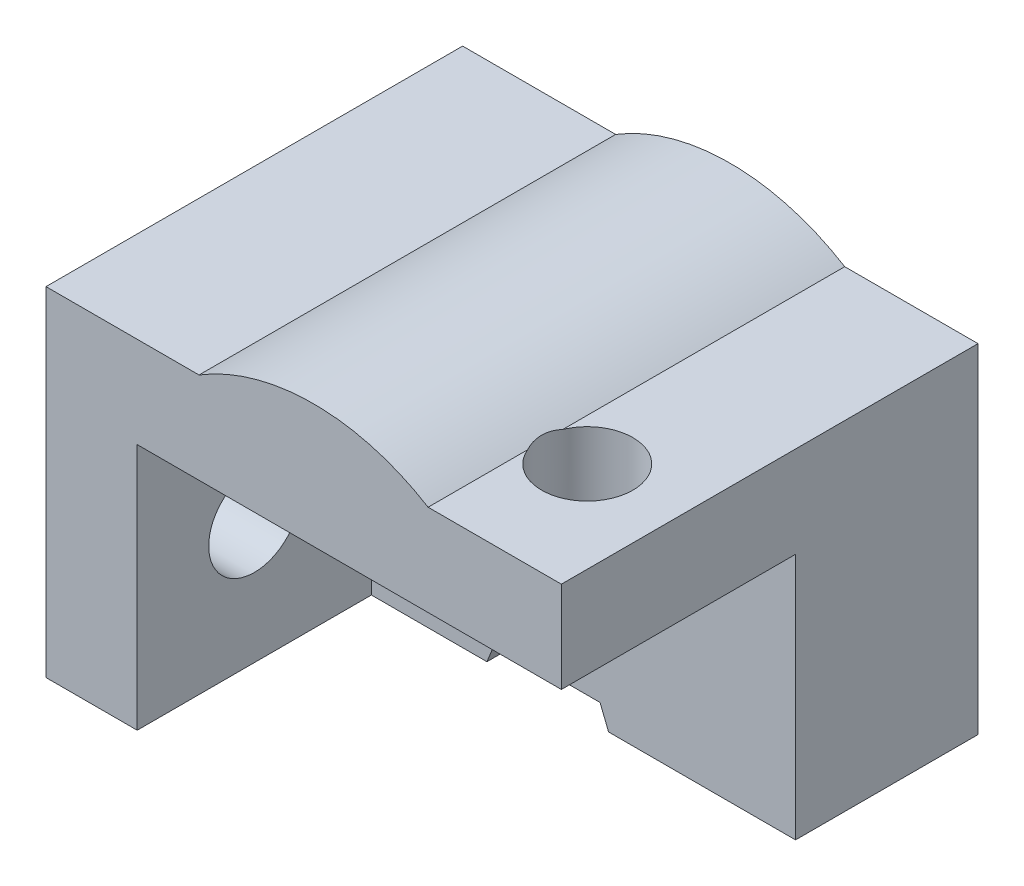
ISO-10303-21;
HEADER;
FILE_DESCRIPTION(('STEP AP214'),'2;1');
FILE_NAME('part.step','',(''),(''),'','','');
FILE_SCHEMA(('AUTOMOTIVE_DESIGN { 1 0 10303 214 1 1 1 1 }'));
ENDSEC;
DATA;
#1=APPLICATION_CONTEXT('core data for automotive mechanical design processes');
#2=APPLICATION_PROTOCOL_DEFINITION('international standard','automotive_design',2000,#1);
#3=PRODUCT_CONTEXT('',#1,'mechanical');
#4=PRODUCT('Part','Part','',(#3));
#5=PRODUCT_RELATED_PRODUCT_CATEGORY('part','',(#4));
#6=PRODUCT_DEFINITION_FORMATION('','',#4);
#7=PRODUCT_DEFINITION_CONTEXT('part definition',#1,'design');
#8=PRODUCT_DEFINITION('design','',#6,#7);
#9=PRODUCT_DEFINITION_SHAPE('','',#8);
#10=(LENGTH_UNIT() NAMED_UNIT(*) SI_UNIT(.MILLI.,.METRE.));
#11=(NAMED_UNIT(*) PLANE_ANGLE_UNIT() SI_UNIT($,.RADIAN.));
#12=(NAMED_UNIT(*) SI_UNIT($,.STERADIAN.) SOLID_ANGLE_UNIT());
#13=UNCERTAINTY_MEASURE_WITH_UNIT(LENGTH_MEASURE(1.E-05),#10,'distance_accuracy_value','');
#14=(GEOMETRIC_REPRESENTATION_CONTEXT(3) GLOBAL_UNCERTAINTY_ASSIGNED_CONTEXT((#13)) GLOBAL_UNIT_ASSIGNED_CONTEXT((#10,
#11,#12)) REPRESENTATION_CONTEXT('',''));
#15=CARTESIAN_POINT('',(0.,0.,0.));
#16=DIRECTION('',(0.,0.,1.));
#17=DIRECTION('',(1.,0.,0.));
#18=AXIS2_PLACEMENT_3D('',#15,#16,#17);
#19=CARTESIAN_POINT('',(-416.117492961021,132.337705363433,-6.));
#20=DIRECTION('',(-1.,0.,0.));
#21=DIRECTION('',(0.,0.,1.));
#22=AXIS2_PLACEMENT_3D('',#19,#20,#21);
#23=PLANE('',#22);
#24=CARTESIAN_POINT('',(-416.117492961021,136.405762971774,3.85111391374171));
#25=DIRECTION('',(-1.,0.,0.));
#26=DIRECTION('',(0.,0.,1.));
#27=AXIS2_PLACEMENT_3D('',#24,#25,#26);
#28=CIRCLE('',#27,1.5);
#29=CARTESIAN_POINT('',(-416.117492961021,136.405762971774,5.35111391374171));
#30=VERTEX_POINT('',#29);
#31=EDGE_CURVE('E301',#30,#30,#28,.T.);
#32=ORIENTED_EDGE('',*,*,#31,.F.);
#33=EDGE_LOOP('',(#32));
#34=FACE_BOUND('',#33,.T.);
#35=DIRECTION('',(0.,0.,1.));
#36=VECTOR('',#35,1.);
#37=CARTESIAN_POINT('',(-416.117492961021,132.337705363433,-6.));
#38=LINE('',#37,#36);
#39=CARTESIAN_POINT('',(-416.117492961021,132.337705363433,-6.));
#40=VERTEX_POINT('',#39);
#41=CARTESIAN_POINT('',(-416.117492961021,132.337705363433,7.7022278274818));
#42=VERTEX_POINT('',#41);
#43=EDGE_CURVE('E199',#40,#42,#38,.T.);
#44=ORIENTED_EDGE('',*,*,#43,.T.);
#45=DIRECTION('',(0.,-1.,0.));
#46=VECTOR('',#45,1.);
#47=CARTESIAN_POINT('',(-416.117492961021,143.473820580116,7.70222782748179));
#48=LINE('',#47,#46);
#49=CARTESIAN_POINT('',(-416.117492961021,143.473820580116,7.7022278274818));
#50=VERTEX_POINT('',#49);
#51=EDGE_CURVE('E309',#50,#42,#48,.T.);
#52=ORIENTED_EDGE('',*,*,#51,.F.);
#53=DIRECTION('',(0.,0.,1.));
#54=VECTOR('',#53,1.);
#55=CARTESIAN_POINT('',(-416.117492961021,143.473820580116,-6.));
#56=LINE('',#55,#54);
#57=CARTESIAN_POINT('',(-416.117492961021,143.473820580116,-6.));
#58=VERTEX_POINT('',#57);
#59=EDGE_CURVE('E175',#58,#50,#56,.T.);
#60=ORIENTED_EDGE('',*,*,#59,.F.);
#61=DIRECTION('',(0.,-1.,0.));
#62=VECTOR('',#61,1.);
#63=CARTESIAN_POINT('',(-416.117492961021,132.337705363433,-6.));
#64=LINE('',#63,#62);
#65=EDGE_CURVE('E218',#58,#40,#64,.T.);
#66=ORIENTED_EDGE('',*,*,#65,.T.);
#67=EDGE_LOOP('',(#44,#52,#60,#66));
#68=FACE_BOUND('',#67,.T.);
#69=ADVANCED_FACE('F37',(#34,#68),#23,.T.);
#70=CARTESIAN_POINT('',(-416.117492961021,143.473820580116,-6.));
#71=DIRECTION('',(0.,1.,0.));
#72=DIRECTION('',(0.,0.,1.));
#73=AXIS2_PLACEMENT_3D('',#70,#71,#72);
#74=PLANE('',#73);
#75=ORIENTED_EDGE('',*,*,#59,.T.);
#76=DIRECTION('',(-1.,0.,0.));
#77=VECTOR('',#76,1.);
#78=CARTESIAN_POINT('',(-411.084201079699,143.473820580116,7.70222782748179));
#79=LINE('',#78,#77);
#80=CARTESIAN_POINT('',(-411.084201079699,143.473820580116,7.70222782748179));
#81=VERTEX_POINT('',#80);
#82=EDGE_CURVE('E305',#81,#50,#79,.T.);
#83=ORIENTED_EDGE('',*,*,#82,.F.);
#84=DIRECTION('',(0.,0.,1.));
#85=VECTOR('',#84,1.);
#86=CARTESIAN_POINT('',(-411.084201079699,143.473820580116,-6.));
#87=LINE('',#86,#85);
#88=CARTESIAN_POINT('',(-411.084201079699,143.473820580116,-6.));
#89=VERTEX_POINT('',#88);
#90=EDGE_CURVE('E171',#89,#81,#87,.T.);
#91=ORIENTED_EDGE('',*,*,#90,.F.);
#92=DIRECTION('',(-1.,0.,0.));
#93=VECTOR('',#92,1.);
#94=CARTESIAN_POINT('',(-416.117492961021,143.473820580116,-6.));
#95=LINE('',#94,#93);
#96=EDGE_CURVE('E201',#89,#58,#95,.T.);
#97=ORIENTED_EDGE('',*,*,#96,.T.);
#98=EDGE_LOOP('',(#75,#83,#91,#97));
#99=FACE_BOUND('',#98,.T.);
#100=ADVANCED_FACE('F394',(#99),#74,.T.);
#101=CARTESIAN_POINT('',(-407.317492961529,137.337705363433,-6.));
#102=DIRECTION('',(0.,0.,1.));
#103=DIRECTION('',(1.,0.,0.));
#104=AXIS2_PLACEMENT_3D('',#101,#102,#103);
#105=CYLINDRICAL_SURFACE('',#104,7.19999999999263);
#106=CARTESIAN_POINT('',(-403.550784843358,143.473820580116,3.27102463656751));
#107=CARTESIAN_POINT('',(-403.564650401877,143.482331151145,3.3040855340003));
#108=CARTESIAN_POINT('',(-403.577390825231,143.490088377443,3.3377964479744));
#109=CARTESIAN_POINT('',(-403.600491203559,143.504072347545,3.40633862218128));
#110=CARTESIAN_POINT('',(-403.610850765418,143.510298838616,3.44117006634842));
#111=CARTESIAN_POINT('',(-403.638121552655,143.526621769063,3.54692348351834));
#112=CARTESIAN_POINT('',(-403.651279057615,143.534394488866,3.61923277436381));
#113=CARTESIAN_POINT('',(-403.66685834284,143.543585637171,3.76549338093935));
#114=CARTESIAN_POINT('',(-403.669260779367,143.544992616494,3.83944741505947));
#115=CARTESIAN_POINT('',(-403.663163543026,143.54140493934,3.98672819446422));
#116=CARTESIAN_POINT('',(-403.654670882556,143.536414400491,4.06005531268223));
#117=CARTESIAN_POINT('',(-403.631095503082,143.522412454836,4.18375522270031));
#118=CARTESIAN_POINT('',(-403.618526258255,143.51491961094,4.23480249352489));
#119=CARTESIAN_POINT('',(-403.588346191664,143.496743798843,4.33475904143771));
#120=CARTESIAN_POINT('',(-403.570738761059,143.486062976237,4.38366973120125));
#121=CARTESIAN_POINT('',(-403.550784843358,143.473820580116,4.43120319091591));
#122=B_SPLINE_CURVE_WITH_KNOTS('',3,(#106,#107,#108,#109,#110,#111,#112,#113,#114,#115,#116,
#117,#118,#119,#120,#121),.UNSPECIFIED.,.F.,.F.,(4,2,2,2,2,2,2,4),(0.,0.110480348319806,
0.220978925399781,0.441552332614348,0.662522297469281,0.883350111005528,1.04229878647173,
1.20114072557143),.UNSPECIFIED.);
#123=CARTESIAN_POINT('',(-403.550784843358,143.473820580116,3.27102463656751));
#124=VERTEX_POINT('',#123);
#125=CARTESIAN_POINT('',(-403.550784843358,143.473820580116,4.43120319091591));
#126=VERTEX_POINT('',#125);
#127=EDGE_CURVE('E51',#124,#126,#122,.T.);
#128=ORIENTED_EDGE('',*,*,#127,.F.);
#129=DIRECTION('',(0.,0.,1.));
#130=VECTOR('',#129,1.);
#131=CARTESIAN_POINT('',(-403.550784843358,143.473820580116,-6.));
#132=LINE('',#131,#130);
#133=CARTESIAN_POINT('',(-403.550784843358,143.473820580116,-6.));
#134=VERTEX_POINT('',#133);
#135=EDGE_CURVE('E159',#134,#124,#132,.T.);
#136=ORIENTED_EDGE('',*,*,#135,.F.);
#137=CARTESIAN_POINT('',(-407.317492961529,137.337705363433,-6.));
#138=DIRECTION('',(0.,0.,1.));
#139=DIRECTION('',(1.,0.,0.));
#140=AXIS2_PLACEMENT_3D('',#137,#138,#139);
#141=CIRCLE('',#140,7.19999999999263);
#142=EDGE_CURVE('E239',#134,#89,#141,.T.);
#143=ORIENTED_EDGE('',*,*,#142,.T.);
#144=ORIENTED_EDGE('',*,*,#90,.T.);
#145=CARTESIAN_POINT('',(-407.317492961529,137.337705363433,7.70222782748179));
#146=DIRECTION('',(0.,0.,1.));
#147=DIRECTION('',(1.,0.,0.));
#148=AXIS2_PLACEMENT_3D('',#145,#146,#147);
#149=CIRCLE('',#148,7.19999999999263);
#150=CARTESIAN_POINT('',(-403.550784843358,143.473820580116,7.7022278274818));
#151=VERTEX_POINT('',#150);
#152=EDGE_CURVE('E290',#151,#81,#149,.T.);
#153=ORIENTED_EDGE('',*,*,#152,.F.);
#154=EDGE_CURVE('E162',#126,#151,#132,.T.);
#155=ORIENTED_EDGE('',*,*,#154,.F.);
#156=EDGE_LOOP('',(#128,#136,#143,#144,#153,#155));
#157=FACE_BOUND('',#156,.T.);
#158=ADVANCED_FACE('F157',(#157),#105,.T.);
#159=CARTESIAN_POINT('',(-403.550784843358,143.473820580116,-6.));
#160=DIRECTION('',(0.,1.,0.));
#161=DIRECTION('',(-1.,0.,0.));
#162=AXIS2_PLACEMENT_3D('',#159,#160,#161);
#163=PLANE('',#162);
#164=CARTESIAN_POINT('',(-402.167492961451,143.473820580116,3.85111391374171));
#165=DIRECTION('',(0.,1.,0.));
#166=DIRECTION('',(-1.,0.,0.));
#167=AXIS2_PLACEMENT_3D('',#164,#165,#166);
#168=CIRCLE('',#167,1.50000000001471);
#169=EDGE_CURVE('E147',#126,#124,#168,.T.);
#170=ORIENTED_EDGE('',*,*,#169,.F.);
#171=ORIENTED_EDGE('',*,*,#154,.T.);
#172=DIRECTION('',(-1.,0.,0.));
#173=VECTOR('',#172,1.);
#174=CARTESIAN_POINT('',(-399.167492961451,143.473820580116,7.70222782748179));
#175=LINE('',#174,#173);
#176=CARTESIAN_POINT('',(-399.167492961451,143.473820580116,7.7022278274818));
#177=VERTEX_POINT('',#176);
#178=EDGE_CURVE('E287',#177,#151,#175,.T.);
#179=ORIENTED_EDGE('',*,*,#178,.F.);
#180=DIRECTION('',(0.,0.,1.));
#181=VECTOR('',#180,1.);
#182=CARTESIAN_POINT('',(-399.167492961451,143.473820580116,-6.));
#183=LINE('',#182,#181);
#184=CARTESIAN_POINT('',(-399.167492961451,143.473820580116,-6.));
#185=VERTEX_POINT('',#184);
#186=EDGE_CURVE('E178',#185,#177,#183,.T.);
#187=ORIENTED_EDGE('',*,*,#186,.F.);
#188=DIRECTION('',(-1.,0.,0.));
#189=VECTOR('',#188,1.);
#190=CARTESIAN_POINT('',(-403.550784843358,143.473820580116,-6.));
#191=LINE('',#190,#189);
#192=EDGE_CURVE('E169',#185,#134,#191,.T.);
#193=ORIENTED_EDGE('',*,*,#192,.T.);
#194=ORIENTED_EDGE('',*,*,#135,.T.);
#195=EDGE_LOOP('',(#170,#171,#179,#187,#193,#194));
#196=FACE_BOUND('',#195,.T.);
#197=ADVANCED_FACE('F167',(#196),#163,.T.);
#198=CARTESIAN_POINT('',(-399.167492961451,143.473820580116,-6.));
#199=DIRECTION('',(1.,0.,0.));
#200=DIRECTION('',(0.,0.,-1.));
#201=AXIS2_PLACEMENT_3D('',#198,#199,#200);
#202=PLANE('',#201);
#203=DIRECTION('',(0.,1.,0.));
#204=VECTOR('',#203,1.);
#205=CARTESIAN_POINT('',(-399.167492961451,143.473820580116,0.));
#206=LINE('',#205,#204);
#207=CARTESIAN_POINT('',(-399.167492961451,132.337705363433,0.));
#208=VERTEX_POINT('',#207);
#209=CARTESIAN_POINT('',(-399.167492961451,140.473820580115,0.));
#210=VERTEX_POINT('',#209);
#211=EDGE_CURVE('E59',#208,#210,#206,.T.);
#212=ORIENTED_EDGE('',*,*,#211,.F.);
#213=DIRECTION('',(0.,0.,1.));
#214=VECTOR('',#213,1.);
#215=CARTESIAN_POINT('',(-399.167492961451,132.337705363433,-6.));
#216=LINE('',#215,#214);
#217=CARTESIAN_POINT('',(-399.167492961451,132.337705363433,-6.));
#218=VERTEX_POINT('',#217);
#219=EDGE_CURVE('E183',#218,#208,#216,.T.);
#220=ORIENTED_EDGE('',*,*,#219,.F.);
#221=DIRECTION('',(0.,1.,0.));
#222=VECTOR('',#221,1.);
#223=CARTESIAN_POINT('',(-399.167492961451,143.473820580116,-6.));
#224=LINE('',#223,#222);
#225=EDGE_CURVE('E244',#218,#185,#224,.T.);
#226=ORIENTED_EDGE('',*,*,#225,.T.);
#227=ORIENTED_EDGE('',*,*,#186,.T.);
#228=DIRECTION('',(0.,1.,0.));
#229=VECTOR('',#228,1.);
#230=CARTESIAN_POINT('',(-399.167492961451,140.473820580115,7.70222782748179));
#231=LINE('',#230,#229);
#232=CARTESIAN_POINT('',(-399.167492961451,140.473820580115,7.7022278274818));
#233=VERTEX_POINT('',#232);
#234=EDGE_CURVE('E325',#233,#177,#231,.T.);
#235=ORIENTED_EDGE('',*,*,#234,.F.);
#236=DIRECTION('',(0.,0.,-1.));
#237=VECTOR('',#236,1.);
#238=CARTESIAN_POINT('',(-399.167492961451,140.473820580115,28.5862528223257));
#239=LINE('',#238,#237);
#240=EDGE_CURVE('E288',#233,#210,#239,.T.);
#241=ORIENTED_EDGE('',*,*,#240,.T.);
#242=EDGE_LOOP('',(#212,#220,#226,#227,#235,#241));
#243=FACE_BOUND('',#242,.T.);
#244=ADVANCED_FACE('F424',(#243),#202,.T.);
#245=CARTESIAN_POINT('',(-405.317492961514,132.337705363433,-6.));
#246=DIRECTION('',(0.,-1.,0.));
#247=DIRECTION('',(1.,0.,0.));
#248=AXIS2_PLACEMENT_3D('',#245,#246,#247);
#249=PLANE('',#248);
#250=DIRECTION('',(1.,0.,0.));
#251=VECTOR('',#250,1.);
#252=CARTESIAN_POINT('',(-405.317492961514,132.337705363433,0.));
#253=LINE('',#252,#251);
#254=CARTESIAN_POINT('',(-405.317492961514,132.337705363433,0.));
#255=VERTEX_POINT('',#254);
#256=EDGE_CURVE('E219',#255,#208,#253,.T.);
#257=ORIENTED_EDGE('',*,*,#256,.F.);
#258=DIRECTION('',(0.,0.,1.));
#259=VECTOR('',#258,1.);
#260=CARTESIAN_POINT('',(-405.317492961514,132.337705363433,-6.));
#261=LINE('',#260,#259);
#262=CARTESIAN_POINT('',(-405.317492961514,132.337705363433,-6.));
#263=VERTEX_POINT('',#262);
#264=EDGE_CURVE('E186',#263,#255,#261,.T.);
#265=ORIENTED_EDGE('',*,*,#264,.F.);
#266=DIRECTION('',(1.,0.,0.));
#267=VECTOR('',#266,1.);
#268=CARTESIAN_POINT('',(-405.317492961514,132.337705363433,-6.));
#269=LINE('',#268,#267);
#270=EDGE_CURVE('E248',#263,#218,#269,.T.);
#271=ORIENTED_EDGE('',*,*,#270,.T.);
#272=ORIENTED_EDGE('',*,*,#219,.T.);
#273=EDGE_LOOP('',(#257,#265,#271,#272));
#274=FACE_BOUND('',#273,.T.);
#275=ADVANCED_FACE('F431',(#274),#249,.T.);
#276=CARTESIAN_POINT('',(-405.597492961514,133.037705363433,-6.));
#277=DIRECTION('',(-0.928476690885259,-0.371390676354104,0.));
#278=DIRECTION('',(0.371390676354104,-0.928476690885259,0.));
#279=AXIS2_PLACEMENT_3D('',#276,#277,#278);
#280=PLANE('',#279);
#281=DIRECTION('',(0.,0.,-1.));
#282=VECTOR('',#281,1.);
#283=CARTESIAN_POINT('',(-405.42340051211,132.602474239922,-4.10000000001002));
#284=LINE('',#283,#282);
#285=CARTESIAN_POINT('',(-405.42340051211,132.602474239922,-6.));
#286=VERTEX_POINT('',#285);
#287=CARTESIAN_POINT('',(-405.42340051211,132.602474239922,-1.9));
#288=VERTEX_POINT('',#287);
#289=EDGE_CURVE('E269',#286,#288,#284,.F.);
#290=ORIENTED_EDGE('',*,*,#289,.F.);
#291=DIRECTION('',(0.371390676354104,-0.928476690885259,0.));
#292=VECTOR('',#291,1.);
#293=CARTESIAN_POINT('',(-405.597492961514,133.037705363433,-6.));
#294=LINE('',#293,#292);
#295=EDGE_CURVE('E252',#286,#263,#294,.T.);
#296=ORIENTED_EDGE('',*,*,#295,.T.);
#297=ORIENTED_EDGE('',*,*,#264,.T.);
#298=DIRECTION('',(0.371390676354104,-0.928476690885259,0.));
#299=VECTOR('',#298,1.);
#300=CARTESIAN_POINT('',(-405.597492961514,133.037705363433,0.));
#301=LINE('',#300,#299);
#302=CARTESIAN_POINT('',(-405.597492961514,133.037705363433,0.));
#303=VERTEX_POINT('',#302);
#304=EDGE_CURVE('E221',#303,#255,#301,.T.);
#305=ORIENTED_EDGE('',*,*,#304,.F.);
#306=DIRECTION('',(0.,0.,1.));
#307=VECTOR('',#306,1.);
#308=CARTESIAN_POINT('',(-405.597492961514,133.037705363433,-6.));
#309=LINE('',#308,#307);
#310=CARTESIAN_POINT('',(-405.597492961514,133.037705363433,-1.9));
#311=VERTEX_POINT('',#310);
#312=EDGE_CURVE('E189',#311,#303,#309,.T.);
#313=ORIENTED_EDGE('',*,*,#312,.F.);
#314=DIRECTION('',(-0.371390676354104,0.928476690885259,0.));
#315=VECTOR('',#314,1.);
#316=CARTESIAN_POINT('',(-405.597492961514,133.037705363433,-1.9));
#317=LINE('',#316,#315);
#318=EDGE_CURVE('E236',#288,#311,#317,.T.);
#319=ORIENTED_EDGE('',*,*,#318,.F.);
#320=EDGE_LOOP('',(#290,#296,#297,#305,#313,#319));
#321=FACE_BOUND('',#320,.T.);
#322=ADVANCED_FACE('F435',(#321),#280,.T.);
#323=CARTESIAN_POINT('',(-409.037492961514,133.037705363433,-6.));
#324=DIRECTION('',(0.,-1.,0.));
#325=DIRECTION('',(0.,0.,-1.));
#326=AXIS2_PLACEMENT_3D('',#323,#324,#325);
#327=PLANE('',#326);
#328=DIRECTION('',(-1.,0.,0.));
#329=VECTOR('',#328,1.);
#330=CARTESIAN_POINT('',(-409.037492961514,133.037705363433,-1.9));
#331=LINE('',#330,#329);
#332=CARTESIAN_POINT('',(-409.037492961514,133.037705363433,-1.9));
#333=VERTEX_POINT('',#332);
#334=EDGE_CURVE('E266',#311,#333,#331,.T.);
#335=ORIENTED_EDGE('',*,*,#334,.F.);
#336=ORIENTED_EDGE('',*,*,#312,.T.);
#337=DIRECTION('',(1.,0.,0.));
#338=VECTOR('',#337,1.);
#339=CARTESIAN_POINT('',(-409.037492961514,133.037705363433,0.));
#340=LINE('',#339,#338);
#341=CARTESIAN_POINT('',(-409.037492961514,133.037705363433,0.));
#342=VERTEX_POINT('',#341);
#343=EDGE_CURVE('E225',#342,#303,#340,.T.);
#344=ORIENTED_EDGE('',*,*,#343,.F.);
#345=DIRECTION('',(0.,0.,1.));
#346=VECTOR('',#345,1.);
#347=CARTESIAN_POINT('',(-409.037492961514,133.037705363433,-6.));
#348=LINE('',#347,#346);
#349=EDGE_CURVE('E192',#333,#342,#348,.T.);
#350=ORIENTED_EDGE('',*,*,#349,.F.);
#351=EDGE_LOOP('',(#335,#336,#344,#350));
#352=FACE_BOUND('',#351,.T.);
#353=ADVANCED_FACE('F442',(#352),#327,.T.);
#354=CARTESIAN_POINT('',(-409.317492961514,132.337705363433,-6.));
#355=DIRECTION('',(0.928476690885259,-0.371390676354104,0.));
#356=DIRECTION('',(0.371390676354104,0.928476690885259,0.));
#357=AXIS2_PLACEMENT_3D('',#354,#355,#356);
#358=PLANE('',#357);
#359=DIRECTION('',(0.,0.,-1.));
#360=VECTOR('',#359,1.);
#361=CARTESIAN_POINT('',(-409.211585410922,132.602474239914,-4.10000000001002));
#362=LINE('',#361,#360);
#363=CARTESIAN_POINT('',(-409.211585410922,132.602474239914,-1.9));
#364=VERTEX_POINT('',#363);
#365=CARTESIAN_POINT('',(-409.211585410922,132.602474239914,-6.));
#366=VERTEX_POINT('',#365);
#367=EDGE_CURVE('E272',#364,#366,#362,.T.);
#368=ORIENTED_EDGE('',*,*,#367,.F.);
#369=DIRECTION('',(-0.371390676354104,-0.928476690885259,0.));
#370=VECTOR('',#369,1.);
#371=CARTESIAN_POINT('',(-409.317492961514,132.337705363433,-1.9));
#372=LINE('',#371,#370);
#373=EDGE_CURVE('E11',#333,#364,#372,.T.);
#374=ORIENTED_EDGE('',*,*,#373,.F.);
#375=ORIENTED_EDGE('',*,*,#349,.T.);
#376=DIRECTION('',(0.371390676354104,0.928476690885259,0.));
#377=VECTOR('',#376,1.);
#378=CARTESIAN_POINT('',(-409.317492961514,132.337705363433,0.));
#379=LINE('',#378,#377);
#380=CARTESIAN_POINT('',(-409.317492961514,132.337705363433,0.));
#381=VERTEX_POINT('',#380);
#382=EDGE_CURVE('E229',#381,#342,#379,.T.);
#383=ORIENTED_EDGE('',*,*,#382,.F.);
#384=DIRECTION('',(0.,0.,1.));
#385=VECTOR('',#384,1.);
#386=CARTESIAN_POINT('',(-409.317492961514,132.337705363433,-6.));
#387=LINE('',#386,#385);
#388=CARTESIAN_POINT('',(-409.317492961514,132.337705363433,-6.));
#389=VERTEX_POINT('',#388);
#390=EDGE_CURVE('E195',#389,#381,#387,.T.);
#391=ORIENTED_EDGE('',*,*,#390,.F.);
#392=DIRECTION('',(0.371390676354104,0.928476690885259,0.));
#393=VECTOR('',#392,1.);
#394=CARTESIAN_POINT('',(-409.317492961514,132.337705363433,-6.));
#395=LINE('',#394,#393);
#396=EDGE_CURVE('E255',#389,#366,#395,.T.);
#397=ORIENTED_EDGE('',*,*,#396,.T.);
#398=EDGE_LOOP('',(#368,#374,#375,#383,#391,#397));
#399=FACE_BOUND('',#398,.T.);
#400=ADVANCED_FACE('F415',(#399),#358,.T.);
#401=CARTESIAN_POINT('',(-416.117492961021,132.337705363433,-6.));
#402=DIRECTION('',(0.,-1.,0.));
#403=DIRECTION('',(0.,0.,-1.));
#404=AXIS2_PLACEMENT_3D('',#401,#402,#403);
#405=PLANE('',#404);
#406=DIRECTION('',(1.,0.,0.));
#407=VECTOR('',#406,1.);
#408=CARTESIAN_POINT('',(-416.117492961021,132.337705363433,0.));
#409=LINE('',#408,#407);
#410=CARTESIAN_POINT('',(-413.117492961021,132.337705363433,0.));
#411=VERTEX_POINT('',#410);
#412=EDGE_CURVE('E233',#411,#381,#409,.T.);
#413=ORIENTED_EDGE('',*,*,#412,.F.);
#414=DIRECTION('',(0.,0.,-1.));
#415=VECTOR('',#414,1.);
#416=CARTESIAN_POINT('',(-413.117492961021,132.337705363433,28.5862528223257));
#417=LINE('',#416,#415);
#418=CARTESIAN_POINT('',(-413.117492961021,132.337705363433,7.7022278274818));
#419=VERTEX_POINT('',#418);
#420=EDGE_CURVE('E297',#419,#411,#417,.T.);
#421=ORIENTED_EDGE('',*,*,#420,.F.);
#422=DIRECTION('',(1.,0.,0.));
#423=VECTOR('',#422,1.);
#424=CARTESIAN_POINT('',(-416.117492961021,132.337705363433,7.70222782748179));
#425=LINE('',#424,#423);
#426=EDGE_CURVE('E313',#42,#419,#425,.T.);
#427=ORIENTED_EDGE('',*,*,#426,.F.);
#428=ORIENTED_EDGE('',*,*,#43,.F.);
#429=DIRECTION('',(1.,0.,0.));
#430=VECTOR('',#429,1.);
#431=CARTESIAN_POINT('',(-416.117492961021,132.337705363433,-6.));
#432=LINE('',#431,#430);
#433=EDGE_CURVE('E258',#40,#389,#432,.T.);
#434=ORIENTED_EDGE('',*,*,#433,.T.);
#435=ORIENTED_EDGE('',*,*,#390,.T.);
#436=EDGE_LOOP('',(#413,#421,#427,#428,#434,#435));
#437=FACE_BOUND('',#436,.T.);
#438=ADVANCED_FACE('F392',(#437),#405,.T.);
#439=CARTESIAN_POINT('',(-407.317492961529,137.337705363433,-6.));
#440=DIRECTION('',(0.,0.,1.));
#441=DIRECTION('',(1.,0.,0.));
#442=AXIS2_PLACEMENT_3D('',#439,#440,#441);
#443=PLANE('',#442);
#444=ORIENTED_EDGE('',*,*,#295,.F.);
#445=CARTESIAN_POINT('',(-407.317492961526,137.337705363433,-6.));
#446=DIRECTION('',(0.,0.,1.));
#447=DIRECTION('',(1.,0.,0.));
#448=AXIS2_PLACEMENT_3D('',#445,#446,#447);
#449=CIRCLE('',#448,5.10000000000002);
#450=EDGE_CURVE('E45',#286,#366,#449,.T.);
#451=ORIENTED_EDGE('',*,*,#450,.T.);
#452=ORIENTED_EDGE('',*,*,#396,.F.);
#453=ORIENTED_EDGE('',*,*,#433,.F.);
#454=ORIENTED_EDGE('',*,*,#65,.F.);
#455=ORIENTED_EDGE('',*,*,#96,.F.);
#456=ORIENTED_EDGE('',*,*,#142,.F.);
#457=ORIENTED_EDGE('',*,*,#192,.F.);
#458=ORIENTED_EDGE('',*,*,#225,.F.);
#459=ORIENTED_EDGE('',*,*,#270,.F.);
#460=EDGE_LOOP('',(#444,#451,#452,#453,#454,#455,#456,#457,#458,#459));
#461=FACE_BOUND('',#460,.T.);
#462=ADVANCED_FACE('F389',(#461),#443,.F.);
#463=CARTESIAN_POINT('',(-407.317492961529,137.337705363433,0.));
#464=DIRECTION('',(0.,0.,1.));
#465=DIRECTION('',(1.,0.,0.));
#466=AXIS2_PLACEMENT_3D('',#463,#464,#465);
#467=PLANE('',#466);
#468=DIRECTION('',(1.,0.,0.));
#469=VECTOR('',#468,1.);
#470=CARTESIAN_POINT('',(-399.167492961451,140.473820580115,0.));
#471=LINE('',#470,#469);
#472=CARTESIAN_POINT('',(-413.117492961021,140.473820580116,0.));
#473=VERTEX_POINT('',#472);
#474=EDGE_CURVE('E291',#473,#210,#471,.T.);
#475=ORIENTED_EDGE('',*,*,#474,.F.);
#476=DIRECTION('',(0.,1.,0.));
#477=VECTOR('',#476,1.);
#478=CARTESIAN_POINT('',(-413.117492961021,140.473820580116,0.));
#479=LINE('',#478,#477);
#480=EDGE_CURVE('E296',#411,#473,#479,.T.);
#481=ORIENTED_EDGE('',*,*,#480,.F.);
#482=ORIENTED_EDGE('',*,*,#412,.T.);
#483=ORIENTED_EDGE('',*,*,#382,.T.);
#484=ORIENTED_EDGE('',*,*,#343,.T.);
#485=ORIENTED_EDGE('',*,*,#304,.T.);
#486=ORIENTED_EDGE('',*,*,#256,.T.);
#487=ORIENTED_EDGE('',*,*,#211,.T.);
#488=EDGE_LOOP('',(#475,#481,#482,#483,#484,#485,#486,#487));
#489=FACE_BOUND('',#488,.T.);
#490=ADVANCED_FACE('F387',(#489),#467,.T.);
#491=CARTESIAN_POINT('',(-407.317492961526,137.337705363433,-4.10000000001002));
#492=DIRECTION('',(0.,0.,-1.));
#493=DIRECTION('',(-1.,0.,0.));
#494=AXIS2_PLACEMENT_3D('',#491,#492,#493);
#495=CYLINDRICAL_SURFACE('',#494,5.10000000000002);
#496=ORIENTED_EDGE('',*,*,#289,.T.);
#497=CARTESIAN_POINT('',(-407.317492961526,137.337705363433,-1.9));
#498=DIRECTION('',(0.,0.,-1.));
#499=DIRECTION('',(-1.,0.,0.));
#500=AXIS2_PLACEMENT_3D('',#497,#498,#499);
#501=CIRCLE('',#500,5.10000000000002);
#502=EDGE_CURVE('E275',#364,#288,#501,.T.);
#503=ORIENTED_EDGE('',*,*,#502,.F.);
#504=ORIENTED_EDGE('',*,*,#367,.T.);
#505=ORIENTED_EDGE('',*,*,#450,.F.);
#506=EDGE_LOOP('',(#496,#503,#504,#505));
#507=FACE_BOUND('',#506,.T.);
#508=ADVANCED_FACE('F383',(#507),#495,.F.);
#509=CARTESIAN_POINT('',(-407.317492961526,142.437705363433,-1.9));
#510=DIRECTION('',(0.,0.,1.));
#511=DIRECTION('',(1.,0.,0.));
#512=AXIS2_PLACEMENT_3D('',#509,#510,#511);
#513=PLANE('',#512);
#514=ORIENTED_EDGE('',*,*,#318,.T.);
#515=ORIENTED_EDGE('',*,*,#334,.T.);
#516=ORIENTED_EDGE('',*,*,#373,.T.);
#517=ORIENTED_EDGE('',*,*,#502,.T.);
#518=EDGE_LOOP('',(#514,#515,#516,#517));
#519=FACE_BOUND('',#518,.T.);
#520=CARTESIAN_POINT('',(-407.317492961526,137.337705363433,-1.9));
#521=DIRECTION('',(0.,0.,-1.));
#522=DIRECTION('',(-1.,0.,0.));
#523=AXIS2_PLACEMENT_3D('',#520,#521,#522);
#524=CIRCLE('',#523,3.7714820475287);
#525=CARTESIAN_POINT('',(-411.088975009054,137.337705363433,-1.9));
#526=VERTEX_POINT('',#525);
#527=EDGE_CURVE('E279',#526,#526,#524,.T.);
#528=ORIENTED_EDGE('',*,*,#527,.F.);
#529=EDGE_LOOP('',(#528));
#530=FACE_BOUND('',#529,.T.);
#531=ADVANCED_FACE('F379',(#519,#530),#513,.F.);
#532=CARTESIAN_POINT('',(-407.317492961526,137.337705363433,-4.10000000001002));
#533=DIRECTION('',(0.,0.,-1.));
#534=DIRECTION('',(-1.,0.,0.));
#535=AXIS2_PLACEMENT_3D('',#532,#533,#534);
#536=CYLINDRICAL_SURFACE('',#535,3.7714820475287);
#537=CARTESIAN_POINT('',(-407.317492961526,137.337705363433,-1.40000000002324));
#538=DIRECTION('',(0.,0.,-1.));
#539=DIRECTION('',(-1.,0.,0.));
#540=AXIS2_PLACEMENT_3D('',#537,#538,#539);
#541=CIRCLE('',#540,3.7714820475287);
#542=CARTESIAN_POINT('',(-411.088975009054,137.337705363433,-1.40000000002324));
#543=VERTEX_POINT('',#542);
#544=EDGE_CURVE('E283',#543,#543,#541,.T.);
#545=ORIENTED_EDGE('',*,*,#544,.F.);
#546=EDGE_LOOP('',(#545));
#547=FACE_BOUND('',#546,.T.);
#548=ORIENTED_EDGE('',*,*,#527,.T.);
#549=EDGE_LOOP('',(#548));
#550=FACE_BOUND('',#549,.T.);
#551=ADVANCED_FACE('F375',(#547,#550),#536,.F.);
#552=CARTESIAN_POINT('',(-407.317492961526,141.109187410962,-1.40000000002324));
#553=DIRECTION('',(0.,0.,1.));
#554=DIRECTION('',(1.,0.,0.));
#555=AXIS2_PLACEMENT_3D('',#552,#553,#554);
#556=PLANE('',#555);
#557=ORIENTED_EDGE('',*,*,#544,.T.);
#558=EDGE_LOOP('',(#557));
#559=FACE_BOUND('',#558,.T.);
#560=ADVANCED_FACE('F368',(#559),#556,.F.);
#561=CARTESIAN_POINT('',(-413.117492961021,140.473820580116,28.5862528223257));
#562=DIRECTION('',(-1.,0.,0.));
#563=DIRECTION('',(0.,0.,1.));
#564=AXIS2_PLACEMENT_3D('',#561,#562,#563);
#565=PLANE('',#564);
#566=CARTESIAN_POINT('',(-413.117492961021,136.405762971774,3.85111391374171));
#567=DIRECTION('',(1.,0.,0.));
#568=DIRECTION('',(0.,0.,-1.));
#569=AXIS2_PLACEMENT_3D('',#566,#567,#568);
#570=CIRCLE('',#569,1.5);
#571=CARTESIAN_POINT('',(-413.117492961021,136.405762971774,2.35111391374171));
#572=VERTEX_POINT('',#571);
#573=EDGE_CURVE('E164',#572,#572,#570,.T.);
#574=ORIENTED_EDGE('',*,*,#573,.F.);
#575=EDGE_LOOP('',(#574));
#576=FACE_BOUND('',#575,.T.);
#577=DIRECTION('',(0.,1.,0.));
#578=VECTOR('',#577,1.);
#579=CARTESIAN_POINT('',(-413.117492961021,140.473820580116,7.70222782748179));
#580=LINE('',#579,#578);
#581=CARTESIAN_POINT('',(-413.117492961021,140.473820580116,7.7022278274818));
#582=VERTEX_POINT('',#581);
#583=EDGE_CURVE('E317',#419,#582,#580,.T.);
#584=ORIENTED_EDGE('',*,*,#583,.F.);
#585=ORIENTED_EDGE('',*,*,#420,.T.);
#586=ORIENTED_EDGE('',*,*,#480,.T.);
#587=DIRECTION('',(0.,0.,-1.));
#588=VECTOR('',#587,1.);
#589=CARTESIAN_POINT('',(-413.117492961021,140.473820580116,28.5862528223257));
#590=LINE('',#589,#588);
#591=EDGE_CURVE('E292',#582,#473,#590,.T.);
#592=ORIENTED_EDGE('',*,*,#591,.F.);
#593=EDGE_LOOP('',(#584,#585,#586,#592));
#594=FACE_BOUND('',#593,.T.);
#595=ADVANCED_FACE('F364',(#576,#594),#565,.F.);
#596=CARTESIAN_POINT('',(-399.167492961451,140.473820580115,28.5862528223257));
#597=DIRECTION('',(0.,1.,0.));
#598=DIRECTION('',(-1.,0.,0.));
#599=AXIS2_PLACEMENT_3D('',#596,#597,#598);
#600=PLANE('',#599);
#601=CARTESIAN_POINT('',(-402.167492961451,140.473820580115,3.85111391374171));
#602=DIRECTION('',(0.,-1.,0.));
#603=DIRECTION('',(0.,0.,-1.));
#604=AXIS2_PLACEMENT_3D('',#601,#602,#603);
#605=CIRCLE('',#604,1.50000000001471);
#606=CARTESIAN_POINT('',(-402.167492961451,140.473820580115,2.351113913727));
#607=VERTEX_POINT('',#606);
#608=EDGE_CURVE('E154',#607,#607,#605,.T.);
#609=ORIENTED_EDGE('',*,*,#608,.F.);
#610=EDGE_LOOP('',(#609));
#611=FACE_BOUND('',#610,.T.);
#612=DIRECTION('',(1.,0.,0.));
#613=VECTOR('',#612,1.);
#614=CARTESIAN_POINT('',(-399.167492961451,140.473820580115,7.70222782748179));
#615=LINE('',#614,#613);
#616=EDGE_CURVE('E321',#582,#233,#615,.T.);
#617=ORIENTED_EDGE('',*,*,#616,.F.);
#618=ORIENTED_EDGE('',*,*,#591,.T.);
#619=ORIENTED_EDGE('',*,*,#474,.T.);
#620=ORIENTED_EDGE('',*,*,#240,.F.);
#621=EDGE_LOOP('',(#617,#618,#619,#620));
#622=FACE_BOUND('',#621,.T.);
#623=ADVANCED_FACE('F361',(#611,#622),#600,.F.);
#624=CARTESIAN_POINT('',(-407.317492961529,137.337705363433,7.70222782748179));
#625=DIRECTION('',(0.,0.,1.));
#626=DIRECTION('',(1.,0.,0.));
#627=AXIS2_PLACEMENT_3D('',#624,#625,#626);
#628=PLANE('',#627);
#629=ORIENTED_EDGE('',*,*,#152,.T.);
#630=ORIENTED_EDGE('',*,*,#82,.T.);
#631=ORIENTED_EDGE('',*,*,#51,.T.);
#632=ORIENTED_EDGE('',*,*,#426,.T.);
#633=ORIENTED_EDGE('',*,*,#583,.T.);
#634=ORIENTED_EDGE('',*,*,#616,.T.);
#635=ORIENTED_EDGE('',*,*,#234,.T.);
#636=ORIENTED_EDGE('',*,*,#178,.T.);
#637=EDGE_LOOP('',(#629,#630,#631,#632,#633,#634,#635,#636));
#638=FACE_BOUND('',#637,.T.);
#639=ADVANCED_FACE('F359',(#638),#628,.T.);
#640=CARTESIAN_POINT('',(-419.117492961021,136.405762971774,3.85111391374171));
#641=DIRECTION('',(1.,0.,0.));
#642=DIRECTION('',(0.,0.,-1.));
#643=AXIS2_PLACEMENT_3D('',#640,#641,#642);
#644=CYLINDRICAL_SURFACE('',#643,1.5);
#645=ORIENTED_EDGE('',*,*,#31,.T.);
#646=EDGE_LOOP('',(#645));
#647=FACE_BOUND('',#646,.T.);
#648=ORIENTED_EDGE('',*,*,#573,.T.);
#649=EDGE_LOOP('',(#648));
#650=FACE_BOUND('',#649,.T.);
#651=ADVANCED_FACE('F356',(#647,#650),#644,.F.);
#652=CARTESIAN_POINT('',(-402.167492961451,146.473820580115,3.85111391374171));
#653=DIRECTION('',(0.,-1.,0.));
#654=DIRECTION('',(0.,0.,-1.));
#655=AXIS2_PLACEMENT_3D('',#652,#653,#654);
#656=CYLINDRICAL_SURFACE('',#655,1.50000000001471);
#657=ORIENTED_EDGE('',*,*,#127,.T.);
#658=ORIENTED_EDGE('',*,*,#169,.T.);
#659=EDGE_LOOP('',(#657,#658));
#660=FACE_BOUND('',#659,.T.);
#661=ORIENTED_EDGE('',*,*,#608,.T.);
#662=EDGE_LOOP('',(#661));
#663=FACE_BOUND('',#662,.T.);
#664=ADVANCED_FACE('F148',(#660,#663),#656,.F.);
#665=CLOSED_SHELL('',(#69,#100,#158,#197,#244,#275,#322,#353,#400,#438,#462,#490,#508,#531,#551,
#560,#595,#623,#639,#651,#664));
#666=MANIFOLD_SOLID_BREP('B2',#665);
#667=ADVANCED_BREP_SHAPE_REPRESENTATION('',(#18,#666),#14);
#668=SHAPE_DEFINITION_REPRESENTATION(#9,#667);
ENDSEC;
END-ISO-10303-21;
